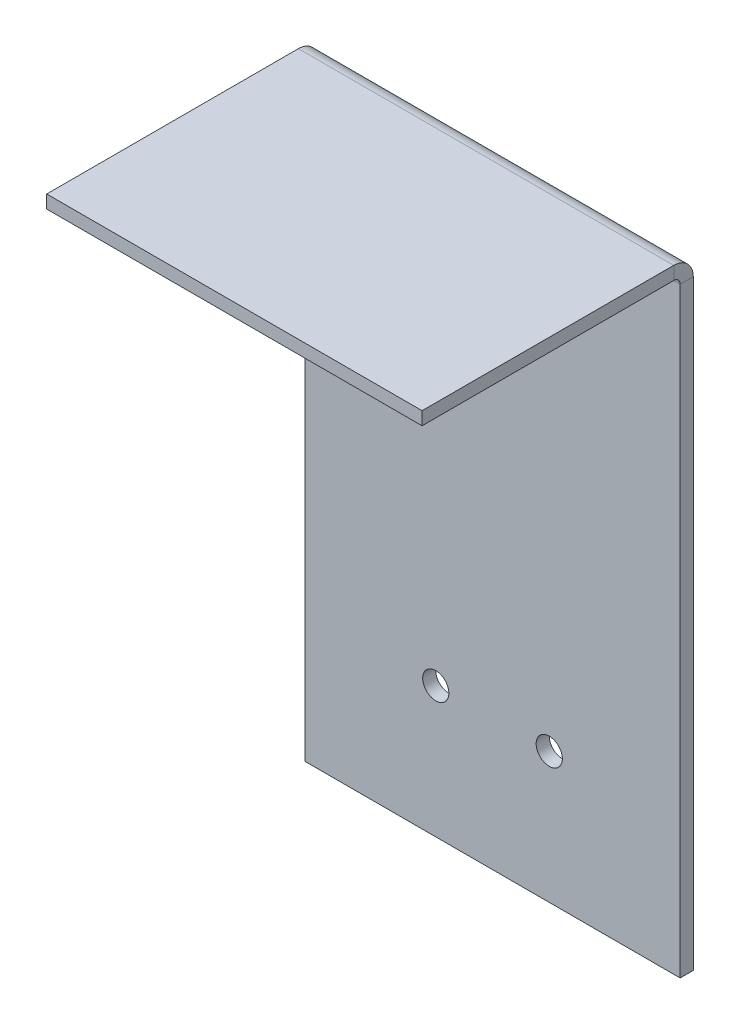
ISO-10303-21;
HEADER;
FILE_DESCRIPTION(('STEP AP214'),'2;1');
FILE_NAME('part.step','',(''),(''),'','','');
FILE_SCHEMA(('AUTOMOTIVE_DESIGN { 1 0 10303 214 1 1 1 1 }'));
ENDSEC;
DATA;
#1=APPLICATION_CONTEXT('core data for automotive mechanical design processes');
#2=APPLICATION_PROTOCOL_DEFINITION('international standard','automotive_design',2000,#1);
#3=PRODUCT_CONTEXT('',#1,'mechanical');
#4=PRODUCT('Part','Part','',(#3));
#5=PRODUCT_RELATED_PRODUCT_CATEGORY('part','',(#4));
#6=PRODUCT_DEFINITION_FORMATION('','',#4);
#7=PRODUCT_DEFINITION_CONTEXT('part definition',#1,'design');
#8=PRODUCT_DEFINITION('design','',#6,#7);
#9=PRODUCT_DEFINITION_SHAPE('','',#8);
#10=(LENGTH_UNIT() NAMED_UNIT(*) SI_UNIT(.MILLI.,.METRE.));
#11=(NAMED_UNIT(*) PLANE_ANGLE_UNIT() SI_UNIT($,.RADIAN.));
#12=(NAMED_UNIT(*) SI_UNIT($,.STERADIAN.) SOLID_ANGLE_UNIT());
#13=UNCERTAINTY_MEASURE_WITH_UNIT(LENGTH_MEASURE(1.E-05),#10,'distance_accuracy_value','');
#14=(GEOMETRIC_REPRESENTATION_CONTEXT(3) GLOBAL_UNCERTAINTY_ASSIGNED_CONTEXT((#13)) GLOBAL_UNIT_ASSIGNED_CONTEXT((#10,
#11,#12)) REPRESENTATION_CONTEXT('',''));
#15=CARTESIAN_POINT('',(0.,0.,0.));
#16=DIRECTION('',(0.,0.,1.));
#17=DIRECTION('',(1.,0.,0.));
#18=AXIS2_PLACEMENT_3D('',#15,#16,#17);
#19=CARTESIAN_POINT('',(0.,69.5690270902936,-70.4309729097067));
#20=DIRECTION('',(0.,1.,0.));
#21=DIRECTION('',(-1.,0.,0.));
#22=AXIS2_PLACEMENT_3D('',#19,#20,#21);
#23=PLANE('',#22);
#24=DIRECTION('',(0.,0.,-1.));
#25=VECTOR('',#24,1.);
#26=CARTESIAN_POINT('',(0.,69.5690270902936,-70.4309729097067));
#27=LINE('',#26,#25);
#28=CARTESIAN_POINT('',(0.,69.5690270902933,29.5690270902933));
#29=VERTEX_POINT('',#28);
#30=CARTESIAN_POINT('',(0.,69.5690270902934,0.73659999999999));
#31=VERTEX_POINT('',#30);
#32=EDGE_CURVE('E68',#29,#31,#27,.T.);
#33=ORIENTED_EDGE('',*,*,#32,.T.);
#34=DIRECTION('',(1.,0.,0.));
#35=VECTOR('',#34,1.);
#36=CARTESIAN_POINT('',(0.,69.5690270902934,0.73659999999999));
#37=LINE('',#36,#35);
#38=CARTESIAN_POINT('',(43.,69.5690270902934,0.73659999999999));
#39=VERTEX_POINT('',#38);
#40=EDGE_CURVE('E60',#31,#39,#37,.T.);
#41=ORIENTED_EDGE('',*,*,#40,.T.);
#42=DIRECTION('',(0.,0.,1.));
#43=VECTOR('',#42,1.);
#44=CARTESIAN_POINT('',(43.,69.5690270902936,-70.4309729097067));
#45=LINE('',#44,#43);
#46=CARTESIAN_POINT('',(43.,69.5690270902933,29.5690270902933));
#47=VERTEX_POINT('',#46);
#48=EDGE_CURVE('E76',#39,#47,#45,.T.);
#49=ORIENTED_EDGE('',*,*,#48,.T.);
#50=DIRECTION('',(-1.,0.,0.));
#51=VECTOR('',#50,1.);
#52=CARTESIAN_POINT('',(0.,69.5690270902933,29.5690270902933));
#53=LINE('',#52,#51);
#54=EDGE_CURVE('E167',#47,#29,#53,.T.);
#55=ORIENTED_EDGE('',*,*,#54,.T.);
#56=EDGE_LOOP('',(#33,#41,#49,#55));
#57=FACE_BOUND('',#56,.T.);
#58=ADVANCED_FACE('F51',(#57),#23,.F.);
#59=CARTESIAN_POINT('',(0.,71.0690270902936,-70.4309729097067));
#60=DIRECTION('',(-1.,0.,0.));
#61=DIRECTION('',(0.,0.,-1.));
#62=AXIS2_PLACEMENT_3D('',#59,#60,#61);
#63=PLANE('',#62);
#64=DIRECTION('',(0.,1.,0.));
#65=VECTOR('',#64,1.);
#66=CARTESIAN_POINT('',(0.,71.0690270902929,0.736600000000004));
#67=LINE('',#66,#65);
#68=CARTESIAN_POINT('',(0.,71.0690270902934,0.736600000000004));
#69=VERTEX_POINT('',#68);
#70=EDGE_CURVE('E14',#31,#69,#67,.T.);
#71=ORIENTED_EDGE('',*,*,#70,.F.);
#72=ORIENTED_EDGE('',*,*,#32,.F.);
#73=DIRECTION('',(0.,-1.,0.));
#74=VECTOR('',#73,1.);
#75=CARTESIAN_POINT('',(0.,71.0690270902933,29.5690270902933));
#76=LINE('',#75,#74);
#77=CARTESIAN_POINT('',(0.,71.0690270902933,29.5690270902933));
#78=VERTEX_POINT('',#77);
#79=EDGE_CURVE('E170',#78,#29,#76,.T.);
#80=ORIENTED_EDGE('',*,*,#79,.F.);
#81=DIRECTION('',(0.,0.,-1.));
#82=VECTOR('',#81,1.);
#83=CARTESIAN_POINT('',(0.,71.0690270902936,-70.4309729097067));
#84=LINE('',#83,#82);
#85=EDGE_CURVE('E169',#78,#69,#84,.T.);
#86=ORIENTED_EDGE('',*,*,#85,.T.);
#87=EDGE_LOOP('',(#71,#72,#80,#86));
#88=FACE_BOUND('',#87,.T.);
#89=ADVANCED_FACE('F53',(#88),#63,.T.);
#90=CARTESIAN_POINT('',(0.,71.0690270902933,29.5690270902933));
#91=DIRECTION('',(0.,0.,1.));
#92=DIRECTION('',(0.,-1.,0.));
#93=AXIS2_PLACEMENT_3D('',#90,#91,#92);
#94=PLANE('',#93);
#95=ORIENTED_EDGE('',*,*,#54,.F.);
#96=DIRECTION('',(0.,-1.,0.));
#97=VECTOR('',#96,1.);
#98=CARTESIAN_POINT('',(43.,71.0690270902933,29.5690270902933));
#99=LINE('',#98,#97);
#100=CARTESIAN_POINT('',(43.,71.0690270902933,29.5690270902933));
#101=VERTEX_POINT('',#100);
#102=EDGE_CURVE('E165',#101,#47,#99,.T.);
#103=ORIENTED_EDGE('',*,*,#102,.F.);
#104=DIRECTION('',(-1.,0.,0.));
#105=VECTOR('',#104,1.);
#106=CARTESIAN_POINT('',(0.,71.0690270902933,29.5690270902933));
#107=LINE('',#106,#105);
#108=EDGE_CURVE('E162',#101,#78,#107,.T.);
#109=ORIENTED_EDGE('',*,*,#108,.T.);
#110=ORIENTED_EDGE('',*,*,#79,.T.);
#111=EDGE_LOOP('',(#95,#103,#109,#110));
#112=FACE_BOUND('',#111,.T.);
#113=ADVANCED_FACE('F188',(#112),#94,.T.);
#114=CARTESIAN_POINT('',(43.,71.0690270902936,-70.4309729097067));
#115=DIRECTION('',(1.,0.,0.));
#116=DIRECTION('',(0.,0.,1.));
#117=AXIS2_PLACEMENT_3D('',#114,#115,#116);
#118=PLANE('',#117);
#119=DIRECTION('',(0.,-1.,0.));
#120=VECTOR('',#119,1.);
#121=CARTESIAN_POINT('',(43.,71.0690270902929,0.736600000000004));
#122=LINE('',#121,#120);
#123=CARTESIAN_POINT('',(43.,71.0690270902934,0.736600000000028));
#124=VERTEX_POINT('',#123);
#125=EDGE_CURVE('E174',#124,#39,#122,.T.);
#126=ORIENTED_EDGE('',*,*,#125,.F.);
#127=DIRECTION('',(0.,0.,1.));
#128=VECTOR('',#127,1.);
#129=CARTESIAN_POINT('',(43.,71.0690270902936,-70.4309729097067));
#130=LINE('',#129,#128);
#131=EDGE_CURVE('E166',#124,#101,#130,.T.);
#132=ORIENTED_EDGE('',*,*,#131,.T.);
#133=ORIENTED_EDGE('',*,*,#102,.T.);
#134=ORIENTED_EDGE('',*,*,#48,.F.);
#135=EDGE_LOOP('',(#126,#132,#133,#134));
#136=FACE_BOUND('',#135,.T.);
#137=ADVANCED_FACE('F183',(#136),#118,.T.);
#138=CARTESIAN_POINT('',(0.,71.0690270902936,-70.4309729097067));
#139=DIRECTION('',(0.,1.,0.));
#140=DIRECTION('',(-1.,0.,0.));
#141=AXIS2_PLACEMENT_3D('',#138,#139,#140);
#142=PLANE('',#141);
#143=DIRECTION('',(1.,0.,0.));
#144=VECTOR('',#143,1.);
#145=CARTESIAN_POINT('',(0.,71.0690270902934,0.736600000000004));
#146=LINE('',#145,#144);
#147=EDGE_CURVE('E140',#69,#124,#146,.T.);
#148=ORIENTED_EDGE('',*,*,#147,.F.);
#149=ORIENTED_EDGE('',*,*,#85,.F.);
#150=ORIENTED_EDGE('',*,*,#108,.F.);
#151=ORIENTED_EDGE('',*,*,#131,.F.);
#152=EDGE_LOOP('',(#148,#149,#150,#151));
#153=FACE_BOUND('',#152,.T.);
#154=ADVANCED_FACE('F190',(#153),#142,.T.);
#155=CARTESIAN_POINT('',(0.,0.,-1.5));
#156=DIRECTION('',(0.,-1.,0.));
#157=DIRECTION('',(0.,0.,-1.));
#158=AXIS2_PLACEMENT_3D('',#155,#156,#157);
#159=PLANE('',#158);
#160=DIRECTION('',(1.,0.,0.));
#161=VECTOR('',#160,1.);
#162=CARTESIAN_POINT('',(0.,0.,0.));
#163=LINE('',#162,#161);
#164=CARTESIAN_POINT('',(0.,0.,0.));
#165=VERTEX_POINT('',#164);
#166=CARTESIAN_POINT('',(43.,0.,0.));
#167=VERTEX_POINT('',#166);
#168=EDGE_CURVE('E213',#165,#167,#163,.T.);
#169=ORIENTED_EDGE('',*,*,#168,.F.);
#170=DIRECTION('',(0.,0.,1.));
#171=VECTOR('',#170,1.);
#172=CARTESIAN_POINT('',(0.,0.,-1.5));
#173=LINE('',#172,#171);
#174=CARTESIAN_POINT('',(0.,0.,-1.5));
#175=VERTEX_POINT('',#174);
#176=EDGE_CURVE('E180',#175,#165,#173,.T.);
#177=ORIENTED_EDGE('',*,*,#176,.F.);
#178=DIRECTION('',(1.,0.,0.));
#179=VECTOR('',#178,1.);
#180=CARTESIAN_POINT('',(0.,0.,-1.5));
#181=LINE('',#180,#179);
#182=CARTESIAN_POINT('',(43.,0.,-1.5));
#183=VERTEX_POINT('',#182);
#184=EDGE_CURVE('E159',#175,#183,#181,.T.);
#185=ORIENTED_EDGE('',*,*,#184,.T.);
#186=DIRECTION('',(0.,0.,1.));
#187=VECTOR('',#186,1.);
#188=CARTESIAN_POINT('',(43.,0.,-1.5));
#189=LINE('',#188,#187);
#190=EDGE_CURVE('E152',#183,#167,#189,.T.);
#191=ORIENTED_EDGE('',*,*,#190,.T.);
#192=EDGE_LOOP('',(#169,#177,#185,#191));
#193=FACE_BOUND('',#192,.T.);
#194=ADVANCED_FACE('F224',(#193),#159,.T.);
#195=CARTESIAN_POINT('',(0.,0.,-1.5));
#196=DIRECTION('',(0.,0.,-1.));
#197=DIRECTION('',(-1.,0.,0.));
#198=AXIS2_PLACEMENT_3D('',#195,#196,#197);
#199=PLANE('',#198);
#200=CARTESIAN_POINT('',(28.,15.,-1.5));
#201=DIRECTION('',(0.,0.,-1.));
#202=DIRECTION('',(-1.,0.,0.));
#203=AXIS2_PLACEMENT_3D('',#200,#201,#202);
#204=CIRCLE('',#203,1.49999999999999);
#205=CARTESIAN_POINT('',(26.5,15.,-1.5));
#206=VERTEX_POINT('',#205);
#207=EDGE_CURVE('E389',#206,#206,#204,.T.);
#208=ORIENTED_EDGE('',*,*,#207,.F.);
#209=EDGE_LOOP('',(#208));
#210=FACE_BOUND('',#209,.T.);
#211=CARTESIAN_POINT('',(15.,15.,-1.5));
#212=DIRECTION('',(0.,0.,-1.));
#213=DIRECTION('',(-1.,0.,0.));
#214=AXIS2_PLACEMENT_3D('',#211,#212,#213);
#215=CIRCLE('',#214,1.49999999999999);
#216=CARTESIAN_POINT('',(13.5,15.,-1.5));
#217=VERTEX_POINT('',#216);
#218=EDGE_CURVE('E392',#217,#217,#215,.T.);
#219=ORIENTED_EDGE('',*,*,#218,.F.);
#220=EDGE_LOOP('',(#219));
#221=FACE_BOUND('',#220,.T.);
#222=DIRECTION('',(0.,-1.,0.));
#223=VECTOR('',#222,1.);
#224=CARTESIAN_POINT('',(0.,0.,-1.5));
#225=LINE('',#224,#223);
#226=CARTESIAN_POINT('',(0.,68.8324270902934,-1.5));
#227=VERTEX_POINT('',#226);
#228=EDGE_CURVE('E150',#227,#175,#225,.T.);
#229=ORIENTED_EDGE('',*,*,#228,.F.);
#230=DIRECTION('',(1.,0.,0.));
#231=VECTOR('',#230,1.);
#232=CARTESIAN_POINT('',(0.,68.8324270902934,-1.5));
#233=LINE('',#232,#231);
#234=CARTESIAN_POINT('',(43.,68.8324270902934,-1.5));
#235=VERTEX_POINT('',#234);
#236=EDGE_CURVE('E138',#227,#235,#233,.T.);
#237=ORIENTED_EDGE('',*,*,#236,.T.);
#238=DIRECTION('',(0.,1.,0.));
#239=VECTOR('',#238,1.);
#240=CARTESIAN_POINT('',(43.,0.,-1.5));
#241=LINE('',#240,#239);
#242=EDGE_CURVE('E131',#183,#235,#241,.T.);
#243=ORIENTED_EDGE('',*,*,#242,.F.);
#244=ORIENTED_EDGE('',*,*,#184,.F.);
#245=EDGE_LOOP('',(#229,#237,#243,#244));
#246=FACE_BOUND('',#245,.T.);
#247=ADVANCED_FACE('F147',(#210,#221,#246),#199,.T.);
#248=CARTESIAN_POINT('',(43.,0.,-1.5));
#249=DIRECTION('',(1.,0.,0.));
#250=DIRECTION('',(0.,1.,0.));
#251=AXIS2_PLACEMENT_3D('',#248,#249,#250);
#252=PLANE('',#251);
#253=ORIENTED_EDGE('',*,*,#242,.T.);
#254=DIRECTION('',(0.,0.,1.));
#255=VECTOR('',#254,1.);
#256=CARTESIAN_POINT('',(43.,68.8324270902934,-1.49999999999952));
#257=LINE('',#256,#255);
#258=CARTESIAN_POINT('',(43.,68.8324270902934,0.));
#259=VERTEX_POINT('',#258);
#260=EDGE_CURVE('E119',#235,#259,#257,.T.);
#261=ORIENTED_EDGE('',*,*,#260,.T.);
#262=DIRECTION('',(0.,1.,0.));
#263=VECTOR('',#262,1.);
#264=CARTESIAN_POINT('',(43.,0.,0.));
#265=LINE('',#264,#263);
#266=EDGE_CURVE('E210',#167,#259,#265,.T.);
#267=ORIENTED_EDGE('',*,*,#266,.F.);
#268=ORIENTED_EDGE('',*,*,#190,.F.);
#269=EDGE_LOOP('',(#253,#261,#267,#268));
#270=FACE_BOUND('',#269,.T.);
#271=ADVANCED_FACE('F154',(#270),#252,.T.);
#272=CARTESIAN_POINT('',(0.,0.,0.));
#273=DIRECTION('',(0.,0.,-1.));
#274=DIRECTION('',(-1.,0.,0.));
#275=AXIS2_PLACEMENT_3D('',#272,#273,#274);
#276=PLANE('',#275);
#277=CARTESIAN_POINT('',(28.,15.,0.));
#278=DIRECTION('',(0.,0.,-1.));
#279=DIRECTION('',(-1.,0.,0.));
#280=AXIS2_PLACEMENT_3D('',#277,#278,#279);
#281=CIRCLE('',#280,1.49999999999999);
#282=CARTESIAN_POINT('',(26.5,15.,0.));
#283=VERTEX_POINT('',#282);
#284=EDGE_CURVE('E55',#283,#283,#281,.T.);
#285=ORIENTED_EDGE('',*,*,#284,.T.);
#286=EDGE_LOOP('',(#285));
#287=FACE_BOUND('',#286,.T.);
#288=CARTESIAN_POINT('',(15.,15.,0.));
#289=DIRECTION('',(0.,0.,-1.));
#290=DIRECTION('',(-1.,0.,0.));
#291=AXIS2_PLACEMENT_3D('',#288,#289,#290);
#292=CIRCLE('',#291,1.49999999999999);
#293=CARTESIAN_POINT('',(13.5,15.,0.));
#294=VERTEX_POINT('',#293);
#295=EDGE_CURVE('E201',#294,#294,#292,.T.);
#296=ORIENTED_EDGE('',*,*,#295,.T.);
#297=EDGE_LOOP('',(#296));
#298=FACE_BOUND('',#297,.T.);
#299=DIRECTION('',(1.,0.,0.));
#300=VECTOR('',#299,1.);
#301=CARTESIAN_POINT('',(0.,68.8324270902934,0.));
#302=LINE('',#301,#300);
#303=CARTESIAN_POINT('',(0.,68.8324270902934,0.));
#304=VERTEX_POINT('',#303);
#305=EDGE_CURVE('E141',#304,#259,#302,.T.);
#306=ORIENTED_EDGE('',*,*,#305,.F.);
#307=DIRECTION('',(0.,-1.,0.));
#308=VECTOR('',#307,1.);
#309=CARTESIAN_POINT('',(0.,0.,0.));
#310=LINE('',#309,#308);
#311=EDGE_CURVE('E130',#304,#165,#310,.T.);
#312=ORIENTED_EDGE('',*,*,#311,.T.);
#313=ORIENTED_EDGE('',*,*,#168,.T.);
#314=ORIENTED_EDGE('',*,*,#266,.T.);
#315=EDGE_LOOP('',(#306,#312,#313,#314));
#316=FACE_BOUND('',#315,.T.);
#317=ADVANCED_FACE('F218',(#287,#298,#316),#276,.F.);
#318=CARTESIAN_POINT('',(0.,0.,-1.5));
#319=DIRECTION('',(-1.,0.,0.));
#320=DIRECTION('',(0.,-1.,0.));
#321=AXIS2_PLACEMENT_3D('',#318,#319,#320);
#322=PLANE('',#321);
#323=ORIENTED_EDGE('',*,*,#311,.F.);
#324=DIRECTION('',(0.,0.,-1.));
#325=VECTOR('',#324,1.);
#326=CARTESIAN_POINT('',(0.,68.8324270902934,-1.49999999999952));
#327=LINE('',#326,#325);
#328=EDGE_CURVE('E208',#304,#227,#327,.T.);
#329=ORIENTED_EDGE('',*,*,#328,.T.);
#330=ORIENTED_EDGE('',*,*,#228,.T.);
#331=ORIENTED_EDGE('',*,*,#176,.T.);
#332=EDGE_LOOP('',(#323,#329,#330,#331));
#333=FACE_BOUND('',#332,.T.);
#334=ADVANCED_FACE('F222',(#333),#322,.T.);
#335=CARTESIAN_POINT('',(0.,68.8324270902934,0.7366));
#336=DIRECTION('',(-1.,0.,0.));
#337=DIRECTION('',(0.,0.,1.));
#338=AXIS2_PLACEMENT_3D('',#335,#336,#337);
#339=PLANE('',#338);
#340=ORIENTED_EDGE('',*,*,#328,.F.);
#341=CARTESIAN_POINT('',(0.,68.8324270902934,0.7366));
#342=DIRECTION('',(1.,0.,0.));
#343=DIRECTION('',(0.,0.,-1.));
#344=AXIS2_PLACEMENT_3D('',#341,#342,#343);
#345=CIRCLE('',#344,0.7366);
#346=EDGE_CURVE('E197',#304,#31,#345,.T.);
#347=ORIENTED_EDGE('',*,*,#346,.T.);
#348=ORIENTED_EDGE('',*,*,#70,.T.);
#349=CARTESIAN_POINT('',(0.,68.8324270902934,0.7366));
#350=DIRECTION('',(1.,0.,0.));
#351=DIRECTION('',(0.,0.,1.));
#352=AXIS2_PLACEMENT_3D('',#349,#350,#351);
#353=CIRCLE('',#352,2.2366);
#354=EDGE_CURVE('E142',#227,#69,#353,.T.);
#355=ORIENTED_EDGE('',*,*,#354,.F.);
#356=EDGE_LOOP('',(#340,#347,#348,#355));
#357=FACE_BOUND('',#356,.T.);
#358=ADVANCED_FACE('F195',(#357),#339,.T.);
#359=CARTESIAN_POINT('',(43.,68.8324270902934,0.7366));
#360=DIRECTION('',(1.,0.,0.));
#361=DIRECTION('',(0.,0.,-1.));
#362=AXIS2_PLACEMENT_3D('',#359,#360,#361);
#363=PLANE('',#362);
#364=CARTESIAN_POINT('',(43.,68.8324270902934,0.7366));
#365=DIRECTION('',(1.,0.,0.));
#366=DIRECTION('',(0.,0.,-1.));
#367=AXIS2_PLACEMENT_3D('',#364,#365,#366);
#368=CIRCLE('',#367,0.7366);
#369=EDGE_CURVE('E125',#39,#259,#368,.F.);
#370=ORIENTED_EDGE('',*,*,#369,.T.);
#371=ORIENTED_EDGE('',*,*,#260,.F.);
#372=CARTESIAN_POINT('',(43.,68.8324270902934,0.7366));
#373=DIRECTION('',(-1.,0.,0.));
#374=DIRECTION('',(0.,0.,-1.));
#375=AXIS2_PLACEMENT_3D('',#372,#373,#374);
#376=CIRCLE('',#375,2.2366);
#377=EDGE_CURVE('E123',#124,#235,#376,.T.);
#378=ORIENTED_EDGE('',*,*,#377,.F.);
#379=ORIENTED_EDGE('',*,*,#125,.T.);
#380=EDGE_LOOP('',(#370,#371,#378,#379));
#381=FACE_BOUND('',#380,.T.);
#382=ADVANCED_FACE('F121',(#381),#363,.T.);
#383=CARTESIAN_POINT('',(-21.5894755827676,68.8324270902934,0.7366));
#384=DIRECTION('',(1.,0.,0.));
#385=DIRECTION('',(0.,0.,-1.));
#386=AXIS2_PLACEMENT_3D('',#383,#384,#385);
#387=CYLINDRICAL_SURFACE('',#386,2.2366);
#388=ORIENTED_EDGE('',*,*,#147,.T.);
#389=ORIENTED_EDGE('',*,*,#377,.T.);
#390=ORIENTED_EDGE('',*,*,#236,.F.);
#391=ORIENTED_EDGE('',*,*,#354,.T.);
#392=EDGE_LOOP('',(#388,#389,#390,#391));
#393=FACE_BOUND('',#392,.T.);
#394=ADVANCED_FACE('F136',(#393),#387,.T.);
#395=CARTESIAN_POINT('',(-21.5894755827676,68.8324270902934,0.7366));
#396=DIRECTION('',(1.,0.,0.));
#397=DIRECTION('',(0.,0.,-1.));
#398=AXIS2_PLACEMENT_3D('',#395,#396,#397);
#399=CYLINDRICAL_SURFACE('',#398,0.7366);
#400=ORIENTED_EDGE('',*,*,#40,.F.);
#401=ORIENTED_EDGE('',*,*,#346,.F.);
#402=ORIENTED_EDGE('',*,*,#305,.T.);
#403=ORIENTED_EDGE('',*,*,#369,.F.);
#404=EDGE_LOOP('',(#400,#401,#402,#403));
#405=FACE_BOUND('',#404,.T.);
#406=ADVANCED_FACE('F284',(#405),#399,.F.);
#407=CARTESIAN_POINT('',(15.,15.,-1.5));
#408=DIRECTION('',(0.,0.,-1.));
#409=DIRECTION('',(-1.,0.,0.));
#410=AXIS2_PLACEMENT_3D('',#407,#408,#409);
#411=CYLINDRICAL_SURFACE('',#410,1.49999999999999);
#412=ORIENTED_EDGE('',*,*,#218,.T.);
#413=EDGE_LOOP('',(#412));
#414=FACE_BOUND('',#413,.T.);
#415=ORIENTED_EDGE('',*,*,#295,.F.);
#416=EDGE_LOOP('',(#415));
#417=FACE_BOUND('',#416,.T.);
#418=ADVANCED_FACE('F291',(#414,#417),#411,.F.);
#419=CARTESIAN_POINT('',(28.,15.,-1.5));
#420=DIRECTION('',(0.,0.,-1.));
#421=DIRECTION('',(-1.,0.,0.));
#422=AXIS2_PLACEMENT_3D('',#419,#420,#421);
#423=CYLINDRICAL_SURFACE('',#422,1.49999999999999);
#424=ORIENTED_EDGE('',*,*,#207,.T.);
#425=EDGE_LOOP('',(#424));
#426=FACE_BOUND('',#425,.T.);
#427=ORIENTED_EDGE('',*,*,#284,.F.);
#428=EDGE_LOOP('',(#427));
#429=FACE_BOUND('',#428,.T.);
#430=ADVANCED_FACE('F298',(#426,#429),#423,.F.);
#431=CLOSED_SHELL('',(#58,#89,#113,#137,#154,#194,#247,#271,#317,#334,#358,#382,#394,#406,#418,#430));
#432=MANIFOLD_SOLID_BREP('B2',#431);
#433=ADVANCED_BREP_SHAPE_REPRESENTATION('',(#18,#432),#14);
#434=SHAPE_DEFINITION_REPRESENTATION(#9,#433);
ENDSEC;
END-ISO-10303-21;
